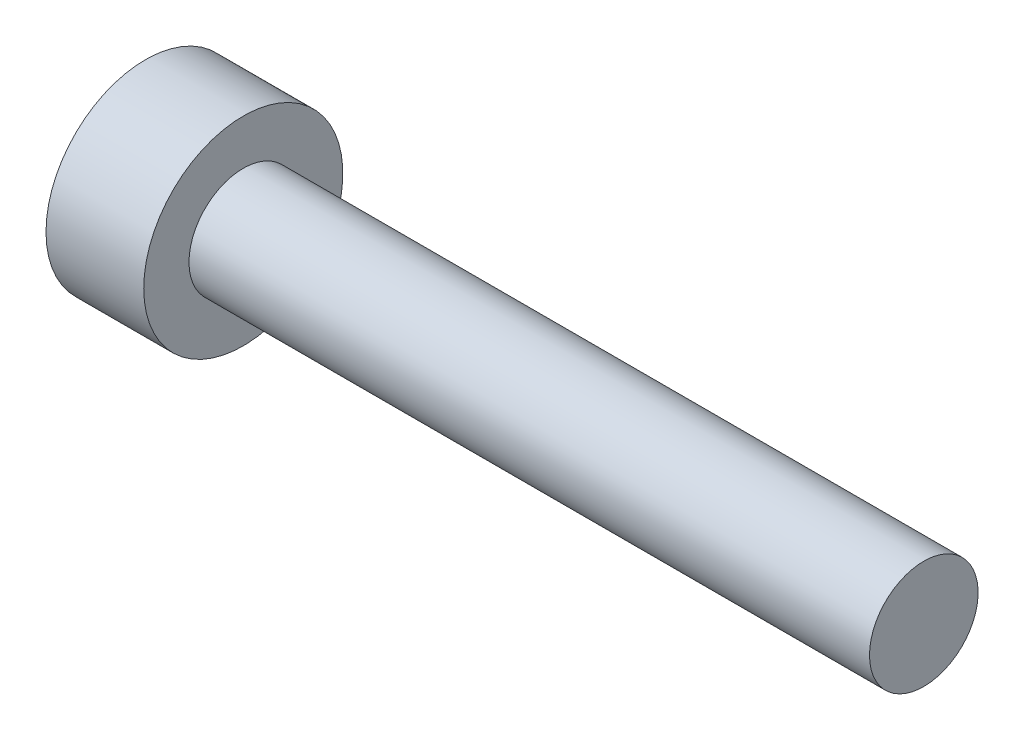
ISO-10303-21;
HEADER;
FILE_DESCRIPTION(('STEP AP214'),'2;1');
FILE_NAME('part.step','',(''),(''),'','','');
FILE_SCHEMA(('AUTOMOTIVE_DESIGN { 1 0 10303 214 1 1 1 1 }'));
ENDSEC;
DATA;
#1=APPLICATION_CONTEXT('core data for automotive mechanical design processes');
#2=APPLICATION_PROTOCOL_DEFINITION('international standard','automotive_design',2000,#1);
#3=PRODUCT_CONTEXT('',#1,'mechanical');
#4=PRODUCT('Part','Part','',(#3));
#5=PRODUCT_RELATED_PRODUCT_CATEGORY('part','',(#4));
#6=PRODUCT_DEFINITION_FORMATION('','',#4);
#7=PRODUCT_DEFINITION_CONTEXT('part definition',#1,'design');
#8=PRODUCT_DEFINITION('design','',#6,#7);
#9=PRODUCT_DEFINITION_SHAPE('','',#8);
#10=(LENGTH_UNIT() NAMED_UNIT(*) SI_UNIT(.MILLI.,.METRE.));
#11=(NAMED_UNIT(*) PLANE_ANGLE_UNIT() SI_UNIT($,.RADIAN.));
#12=(NAMED_UNIT(*) SI_UNIT($,.STERADIAN.) SOLID_ANGLE_UNIT());
#13=UNCERTAINTY_MEASURE_WITH_UNIT(LENGTH_MEASURE(1.E-05),#10,'distance_accuracy_value','');
#14=(GEOMETRIC_REPRESENTATION_CONTEXT(3) GLOBAL_UNCERTAINTY_ASSIGNED_CONTEXT((#13)) GLOBAL_UNIT_ASSIGNED_CONTEXT((#10,
#11,#12)) REPRESENTATION_CONTEXT('',''));
#15=CARTESIAN_POINT('',(0.,0.,0.));
#16=DIRECTION('',(0.,0.,1.));
#17=DIRECTION('',(1.,0.,0.));
#18=AXIS2_PLACEMENT_3D('',#15,#16,#17);
#19=CARTESIAN_POINT('',(146.,2.75,0.));
#20=DIRECTION('',(1.,0.,0.));
#21=DIRECTION('',(0.,0.,-1.));
#22=AXIS2_PLACEMENT_3D('',#19,#20,#21);
#23=PLANE('',#22);
#24=CARTESIAN_POINT('',(146.,0.,0.));
#25=DIRECTION('',(-1.,0.,0.));
#26=DIRECTION('',(0.,0.,1.));
#27=AXIS2_PLACEMENT_3D('',#24,#25,#26);
#28=CIRCLE('',#27,2.75);
#29=CARTESIAN_POINT('',(146.,0.,2.75));
#30=VERTEX_POINT('',#29);
#31=EDGE_CURVE('E45',#30,#30,#28,.T.);
#32=ORIENTED_EDGE('',*,*,#31,.T.);
#33=EDGE_LOOP('',(#32));
#34=FACE_BOUND('',#33,.T.);
#35=ADVANCED_FACE('F31',(#34),#23,.F.);
#36=CARTESIAN_POINT('',(167.5,0.,0.));
#37=DIRECTION('',(-1.,0.,0.));
#38=DIRECTION('',(0.,0.,1.));
#39=AXIS2_PLACEMENT_3D('',#36,#37,#38);
#40=PLANE('',#39);
#41=CARTESIAN_POINT('',(167.5,0.,0.));
#42=DIRECTION('',(-1.,0.,0.));
#43=DIRECTION('',(0.,0.,1.));
#44=AXIS2_PLACEMENT_3D('',#41,#42,#43);
#45=CIRCLE('',#44,1.5);
#46=CARTESIAN_POINT('',(167.5,0.,1.5));
#47=VERTEX_POINT('',#46);
#48=EDGE_CURVE('E10',#47,#47,#45,.T.);
#49=ORIENTED_EDGE('',*,*,#48,.F.);
#50=EDGE_LOOP('',(#49));
#51=FACE_BOUND('',#50,.T.);
#52=ADVANCED_FACE('F65',(#51),#40,.F.);
#53=CARTESIAN_POINT('',(-110.,0.,0.));
#54=DIRECTION('',(-1.,0.,0.));
#55=DIRECTION('',(0.,0.,1.));
#56=AXIS2_PLACEMENT_3D('',#53,#54,#55);
#57=CYLINDRICAL_SURFACE('',#56,1.5);
#58=CARTESIAN_POINT('',(148.7,0.,0.));
#59=DIRECTION('',(-1.,0.,0.));
#60=DIRECTION('',(0.,0.,1.));
#61=AXIS2_PLACEMENT_3D('',#58,#59,#60);
#62=CIRCLE('',#61,1.5);
#63=CARTESIAN_POINT('',(148.7,0.,1.5));
#64=VERTEX_POINT('',#63);
#65=EDGE_CURVE('E37',#64,#64,#62,.T.);
#66=ORIENTED_EDGE('',*,*,#65,.F.);
#67=EDGE_LOOP('',(#66));
#68=FACE_BOUND('',#67,.T.);
#69=ORIENTED_EDGE('',*,*,#48,.T.);
#70=EDGE_LOOP('',(#69));
#71=FACE_BOUND('',#70,.T.);
#72=ADVANCED_FACE('F60',(#68,#71),#57,.T.);
#73=CARTESIAN_POINT('',(148.7,1.5,0.));
#74=DIRECTION('',(-1.,0.,0.));
#75=DIRECTION('',(0.,0.,1.));
#76=AXIS2_PLACEMENT_3D('',#73,#74,#75);
#77=PLANE('',#76);
#78=CARTESIAN_POINT('',(148.7,0.,0.));
#79=DIRECTION('',(-1.,0.,0.));
#80=DIRECTION('',(0.,0.,1.));
#81=AXIS2_PLACEMENT_3D('',#78,#79,#80);
#82=CIRCLE('',#81,2.75);
#83=CARTESIAN_POINT('',(148.7,0.,2.75));
#84=VERTEX_POINT('',#83);
#85=EDGE_CURVE('E41',#84,#84,#82,.T.);
#86=ORIENTED_EDGE('',*,*,#85,.F.);
#87=EDGE_LOOP('',(#86));
#88=FACE_BOUND('',#87,.T.);
#89=ORIENTED_EDGE('',*,*,#65,.T.);
#90=EDGE_LOOP('',(#89));
#91=FACE_BOUND('',#90,.T.);
#92=ADVANCED_FACE('F55',(#88,#91),#77,.F.);
#93=CARTESIAN_POINT('',(-110.,0.,0.));
#94=DIRECTION('',(-1.,0.,0.));
#95=DIRECTION('',(0.,0.,1.));
#96=AXIS2_PLACEMENT_3D('',#93,#94,#95);
#97=CYLINDRICAL_SURFACE('',#96,2.75);
#98=ORIENTED_EDGE('',*,*,#31,.F.);
#99=EDGE_LOOP('',(#98));
#100=FACE_BOUND('',#99,.T.);
#101=ORIENTED_EDGE('',*,*,#85,.T.);
#102=EDGE_LOOP('',(#101));
#103=FACE_BOUND('',#102,.T.);
#104=ADVANCED_FACE('F52',(#100,#103),#97,.T.);
#105=CLOSED_SHELL('',(#35,#52,#72,#92,#104));
#106=MANIFOLD_SOLID_BREP('B2',#105);
#107=ADVANCED_BREP_SHAPE_REPRESENTATION('',(#18,#106),#14);
#108=SHAPE_DEFINITION_REPRESENTATION(#9,#107);
ENDSEC;
END-ISO-10303-21;
